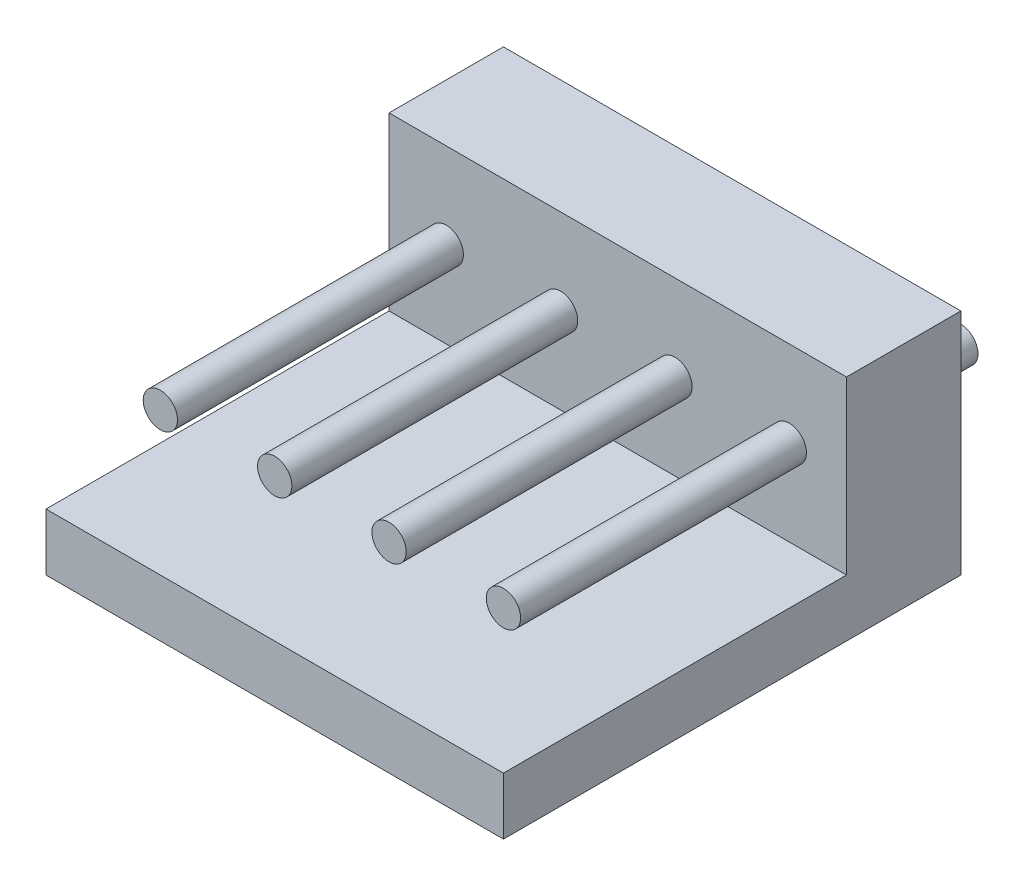
ISO-10303-21;
HEADER;
FILE_DESCRIPTION(('STEP AP214'),'2;1');
FILE_NAME('part.step','',(''),(''),'','','');
FILE_SCHEMA(('AUTOMOTIVE_DESIGN { 1 0 10303 214 1 1 1 1 }'));
ENDSEC;
DATA;
#1=APPLICATION_CONTEXT('core data for automotive mechanical design processes');
#2=APPLICATION_PROTOCOL_DEFINITION('international standard','automotive_design',2000,#1);
#3=PRODUCT_CONTEXT('',#1,'mechanical');
#4=PRODUCT('Part','Part','',(#3));
#5=PRODUCT_RELATED_PRODUCT_CATEGORY('part','',(#4));
#6=PRODUCT_DEFINITION_FORMATION('','',#4);
#7=PRODUCT_DEFINITION_CONTEXT('part definition',#1,'design');
#8=PRODUCT_DEFINITION('design','',#6,#7);
#9=PRODUCT_DEFINITION_SHAPE('','',#8);
#10=(LENGTH_UNIT() NAMED_UNIT(*) SI_UNIT(.MILLI.,.METRE.));
#11=(NAMED_UNIT(*) PLANE_ANGLE_UNIT() SI_UNIT($,.RADIAN.));
#12=(NAMED_UNIT(*) SI_UNIT($,.STERADIAN.) SOLID_ANGLE_UNIT());
#13=UNCERTAINTY_MEASURE_WITH_UNIT(LENGTH_MEASURE(1.E-05),#10,'distance_accuracy_value','');
#14=(GEOMETRIC_REPRESENTATION_CONTEXT(3) GLOBAL_UNCERTAINTY_ASSIGNED_CONTEXT((#13)) GLOBAL_UNIT_ASSIGNED_CONTEXT((#10,
#11,#12)) REPRESENTATION_CONTEXT('',''));
#15=CARTESIAN_POINT('',(0.,0.,0.));
#16=DIRECTION('',(0.,0.,1.));
#17=DIRECTION('',(1.,0.,0.));
#18=AXIS2_PLACEMENT_3D('',#15,#16,#17);
#19=CARTESIAN_POINT('',(0.,10.,5.));
#20=DIRECTION('',(0.,0.,-1.));
#21=DIRECTION('',(-1.,0.,0.));
#22=AXIS2_PLACEMENT_3D('',#19,#20,#21);
#23=PLANE('',#22);
#24=CARTESIAN_POINT('',(17.5,6.25,5.));
#25=DIRECTION('',(0.,0.,-1.));
#26=DIRECTION('',(-1.,0.,0.));
#27=AXIS2_PLACEMENT_3D('',#24,#25,#26);
#28=CIRCLE('',#27,0.750000000000002);
#29=CARTESIAN_POINT('',(16.75,6.25,5.));
#30=VERTEX_POINT('',#29);
#31=EDGE_CURVE('E38',#30,#30,#28,.F.);
#32=ORIENTED_EDGE('',*,*,#31,.F.);
#33=EDGE_LOOP('',(#32));
#34=FACE_BOUND('',#33,.T.);
#35=CARTESIAN_POINT('',(12.5,6.25,5.));
#36=DIRECTION('',(0.,0.,-1.));
#37=DIRECTION('',(-1.,0.,0.));
#38=AXIS2_PLACEMENT_3D('',#35,#36,#37);
#39=CIRCLE('',#38,0.75);
#40=CARTESIAN_POINT('',(11.75,6.25,5.));
#41=VERTEX_POINT('',#40);
#42=EDGE_CURVE('E146',#41,#41,#39,.F.);
#43=ORIENTED_EDGE('',*,*,#42,.F.);
#44=EDGE_LOOP('',(#43));
#45=FACE_BOUND('',#44,.T.);
#46=DIRECTION('',(-1.,0.,0.));
#47=VECTOR('',#46,1.);
#48=CARTESIAN_POINT('',(0.,2.5,5.));
#49=LINE('',#48,#47);
#50=CARTESIAN_POINT('',(20.,2.5,5.));
#51=VERTEX_POINT('',#50);
#52=CARTESIAN_POINT('',(0.,2.5,5.));
#53=VERTEX_POINT('',#52);
#54=EDGE_CURVE('E46',#51,#53,#49,.T.);
#55=ORIENTED_EDGE('',*,*,#54,.F.);
#56=DIRECTION('',(0.,1.,0.));
#57=VECTOR('',#56,1.);
#58=CARTESIAN_POINT('',(20.,0.,5.));
#59=LINE('',#58,#57);
#60=CARTESIAN_POINT('',(20.,10.,5.));
#61=VERTEX_POINT('',#60);
#62=EDGE_CURVE('E86',#51,#61,#59,.T.);
#63=ORIENTED_EDGE('',*,*,#62,.T.);
#64=DIRECTION('',(-1.,0.,0.));
#65=VECTOR('',#64,1.);
#66=CARTESIAN_POINT('',(0.,10.,5.));
#67=LINE('',#66,#65);
#68=CARTESIAN_POINT('',(0.,10.,5.));
#69=VERTEX_POINT('',#68);
#70=EDGE_CURVE('E51',#61,#69,#67,.T.);
#71=ORIENTED_EDGE('',*,*,#70,.T.);
#72=DIRECTION('',(0.,-1.,0.));
#73=VECTOR('',#72,1.);
#74=CARTESIAN_POINT('',(0.,0.,5.));
#75=LINE('',#74,#73);
#76=EDGE_CURVE('E81',#69,#53,#75,.T.);
#77=ORIENTED_EDGE('',*,*,#76,.T.);
#78=EDGE_LOOP('',(#55,#63,#71,#77));
#79=FACE_BOUND('',#78,.T.);
#80=CARTESIAN_POINT('',(7.5,6.25,5.));
#81=DIRECTION('',(0.,0.,-1.));
#82=DIRECTION('',(-1.,0.,0.));
#83=AXIS2_PLACEMENT_3D('',#80,#81,#82);
#84=CIRCLE('',#83,0.75);
#85=CARTESIAN_POINT('',(6.75,6.25,5.));
#86=VERTEX_POINT('',#85);
#87=EDGE_CURVE('E140',#86,#86,#84,.F.);
#88=ORIENTED_EDGE('',*,*,#87,.F.);
#89=EDGE_LOOP('',(#88));
#90=FACE_BOUND('',#89,.T.);
#91=CARTESIAN_POINT('',(2.5,6.25,5.));
#92=DIRECTION('',(0.,0.,-1.));
#93=DIRECTION('',(-1.,0.,0.));
#94=AXIS2_PLACEMENT_3D('',#91,#92,#93);
#95=CIRCLE('',#94,0.750000000000001);
#96=CARTESIAN_POINT('',(1.75,6.25,5.));
#97=VERTEX_POINT('',#96);
#98=EDGE_CURVE('E11',#97,#97,#95,.F.);
#99=ORIENTED_EDGE('',*,*,#98,.F.);
#100=EDGE_LOOP('',(#99));
#101=FACE_BOUND('',#100,.T.);
#102=ADVANCED_FACE('F29',(#34,#45,#79,#90,#101),#23,.F.);
#103=CARTESIAN_POINT('',(0.,10.,0.));
#104=DIRECTION('',(0.,0.,-1.));
#105=DIRECTION('',(-1.,0.,0.));
#106=AXIS2_PLACEMENT_3D('',#103,#104,#105);
#107=PLANE('',#106);
#108=CARTESIAN_POINT('',(17.5,6.25,0.));
#109=DIRECTION('',(0.,0.,-1.));
#110=DIRECTION('',(-1.,0.,0.));
#111=AXIS2_PLACEMENT_3D('',#108,#109,#110);
#112=CIRCLE('',#111,0.750000000000002);
#113=CARTESIAN_POINT('',(16.75,6.25,0.));
#114=VERTEX_POINT('',#113);
#115=EDGE_CURVE('E123',#114,#114,#112,.F.);
#116=ORIENTED_EDGE('',*,*,#115,.T.);
#117=EDGE_LOOP('',(#116));
#118=FACE_BOUND('',#117,.T.);
#119=CARTESIAN_POINT('',(12.5,6.25,0.));
#120=DIRECTION('',(0.,0.,-1.));
#121=DIRECTION('',(-1.,0.,0.));
#122=AXIS2_PLACEMENT_3D('',#119,#120,#121);
#123=CIRCLE('',#122,0.75);
#124=CARTESIAN_POINT('',(11.75,6.25,0.));
#125=VERTEX_POINT('',#124);
#126=EDGE_CURVE('E99',#125,#125,#123,.F.);
#127=ORIENTED_EDGE('',*,*,#126,.T.);
#128=EDGE_LOOP('',(#127));
#129=FACE_BOUND('',#128,.T.);
#130=DIRECTION('',(0.,-1.,0.));
#131=VECTOR('',#130,1.);
#132=CARTESIAN_POINT('',(0.,0.,0.));
#133=LINE('',#132,#131);
#134=CARTESIAN_POINT('',(0.,10.,0.));
#135=VERTEX_POINT('',#134);
#136=CARTESIAN_POINT('',(0.,0.,0.));
#137=VERTEX_POINT('',#136);
#138=EDGE_CURVE('E105',#135,#137,#133,.T.);
#139=ORIENTED_EDGE('',*,*,#138,.F.);
#140=DIRECTION('',(-1.,0.,0.));
#141=VECTOR('',#140,1.);
#142=CARTESIAN_POINT('',(0.,10.,0.));
#143=LINE('',#142,#141);
#144=CARTESIAN_POINT('',(20.,10.,0.));
#145=VERTEX_POINT('',#144);
#146=EDGE_CURVE('E87',#145,#135,#143,.T.);
#147=ORIENTED_EDGE('',*,*,#146,.F.);
#148=DIRECTION('',(0.,1.,0.));
#149=VECTOR('',#148,1.);
#150=CARTESIAN_POINT('',(20.,0.,0.));
#151=LINE('',#150,#149);
#152=CARTESIAN_POINT('',(20.,0.,0.));
#153=VERTEX_POINT('',#152);
#154=EDGE_CURVE('E163',#153,#145,#151,.T.);
#155=ORIENTED_EDGE('',*,*,#154,.F.);
#156=DIRECTION('',(1.,0.,0.));
#157=VECTOR('',#156,1.);
#158=CARTESIAN_POINT('',(0.,0.,0.));
#159=LINE('',#158,#157);
#160=EDGE_CURVE('E161',#137,#153,#159,.T.);
#161=ORIENTED_EDGE('',*,*,#160,.F.);
#162=EDGE_LOOP('',(#139,#147,#155,#161));
#163=FACE_BOUND('',#162,.T.);
#164=CARTESIAN_POINT('',(7.5,6.25,0.));
#165=DIRECTION('',(0.,0.,-1.));
#166=DIRECTION('',(-1.,0.,0.));
#167=AXIS2_PLACEMENT_3D('',#164,#165,#166);
#168=CIRCLE('',#167,0.75);
#169=CARTESIAN_POINT('',(6.75,6.25,0.));
#170=VERTEX_POINT('',#169);
#171=EDGE_CURVE('E119',#170,#170,#168,.F.);
#172=ORIENTED_EDGE('',*,*,#171,.T.);
#173=EDGE_LOOP('',(#172));
#174=FACE_BOUND('',#173,.T.);
#175=CARTESIAN_POINT('',(2.5,6.25,0.));
#176=DIRECTION('',(0.,0.,-1.));
#177=DIRECTION('',(-1.,0.,0.));
#178=AXIS2_PLACEMENT_3D('',#175,#176,#177);
#179=CIRCLE('',#178,0.750000000000001);
#180=CARTESIAN_POINT('',(1.75,6.25,0.));
#181=VERTEX_POINT('',#180);
#182=EDGE_CURVE('E33',#181,#181,#179,.F.);
#183=ORIENTED_EDGE('',*,*,#182,.T.);
#184=EDGE_LOOP('',(#183));
#185=FACE_BOUND('',#184,.T.);
#186=ADVANCED_FACE('F190',(#118,#129,#163,#174,#185),#107,.T.);
#187=CARTESIAN_POINT('',(0.,0.,5.));
#188=DIRECTION('',(1.,0.,0.));
#189=DIRECTION('',(0.,0.,-1.));
#190=AXIS2_PLACEMENT_3D('',#187,#188,#189);
#191=PLANE('',#190);
#192=ORIENTED_EDGE('',*,*,#138,.T.);
#193=DIRECTION('',(0.,0.,-1.));
#194=VECTOR('',#193,1.);
#195=CARTESIAN_POINT('',(0.,0.,5.));
#196=LINE('',#195,#194);
#197=CARTESIAN_POINT('',(0.,0.,20.));
#198=VERTEX_POINT('',#197);
#199=EDGE_CURVE('E152',#198,#137,#196,.T.);
#200=ORIENTED_EDGE('',*,*,#199,.F.);
#201=DIRECTION('',(0.,-1.,0.));
#202=VECTOR('',#201,1.);
#203=CARTESIAN_POINT('',(0.,0.,20.));
#204=LINE('',#203,#202);
#205=CARTESIAN_POINT('',(0.,2.5,20.));
#206=VERTEX_POINT('',#205);
#207=EDGE_CURVE('E98',#206,#198,#204,.T.);
#208=ORIENTED_EDGE('',*,*,#207,.F.);
#209=DIRECTION('',(0.,0.,-1.));
#210=VECTOR('',#209,1.);
#211=CARTESIAN_POINT('',(0.,2.5,20.));
#212=LINE('',#211,#210);
#213=EDGE_CURVE('E94',#206,#53,#212,.T.);
#214=ORIENTED_EDGE('',*,*,#213,.T.);
#215=ORIENTED_EDGE('',*,*,#76,.F.);
#216=DIRECTION('',(0.,0.,-1.));
#217=VECTOR('',#216,1.);
#218=CARTESIAN_POINT('',(0.,10.,5.));
#219=LINE('',#218,#217);
#220=EDGE_CURVE('E173',#69,#135,#219,.T.);
#221=ORIENTED_EDGE('',*,*,#220,.T.);
#222=EDGE_LOOP('',(#192,#200,#208,#214,#215,#221));
#223=FACE_BOUND('',#222,.T.);
#224=ADVANCED_FACE('F31',(#223),#191,.F.);
#225=CARTESIAN_POINT('',(0.,0.,5.));
#226=DIRECTION('',(0.,1.,0.));
#227=DIRECTION('',(0.,0.,1.));
#228=AXIS2_PLACEMENT_3D('',#225,#226,#227);
#229=PLANE('',#228);
#230=ORIENTED_EDGE('',*,*,#160,.T.);
#231=DIRECTION('',(0.,0.,-1.));
#232=VECTOR('',#231,1.);
#233=CARTESIAN_POINT('',(20.,0.,5.));
#234=LINE('',#233,#232);
#235=CARTESIAN_POINT('',(20.,0.,20.));
#236=VERTEX_POINT('',#235);
#237=EDGE_CURVE('E178',#236,#153,#234,.T.);
#238=ORIENTED_EDGE('',*,*,#237,.F.);
#239=DIRECTION('',(1.,0.,0.));
#240=VECTOR('',#239,1.);
#241=CARTESIAN_POINT('',(0.,0.,20.));
#242=LINE('',#241,#240);
#243=EDGE_CURVE('E156',#198,#236,#242,.T.);
#244=ORIENTED_EDGE('',*,*,#243,.F.);
#245=ORIENTED_EDGE('',*,*,#199,.T.);
#246=EDGE_LOOP('',(#230,#238,#244,#245));
#247=FACE_BOUND('',#246,.T.);
#248=ADVANCED_FACE('F186',(#247),#229,.F.);
#249=CARTESIAN_POINT('',(20.,0.,5.));
#250=DIRECTION('',(-1.,0.,0.));
#251=DIRECTION('',(0.,0.,1.));
#252=AXIS2_PLACEMENT_3D('',#249,#250,#251);
#253=PLANE('',#252);
#254=ORIENTED_EDGE('',*,*,#154,.T.);
#255=DIRECTION('',(0.,0.,-1.));
#256=VECTOR('',#255,1.);
#257=CARTESIAN_POINT('',(20.,10.,5.));
#258=LINE('',#257,#256);
#259=EDGE_CURVE('E174',#61,#145,#258,.T.);
#260=ORIENTED_EDGE('',*,*,#259,.F.);
#261=ORIENTED_EDGE('',*,*,#62,.F.);
#262=DIRECTION('',(0.,0.,-1.));
#263=VECTOR('',#262,1.);
#264=CARTESIAN_POINT('',(20.,2.5,20.));
#265=LINE('',#264,#263);
#266=CARTESIAN_POINT('',(20.,2.5,20.));
#267=VERTEX_POINT('',#266);
#268=EDGE_CURVE('E97',#267,#51,#265,.T.);
#269=ORIENTED_EDGE('',*,*,#268,.F.);
#270=DIRECTION('',(0.,1.,0.));
#271=VECTOR('',#270,1.);
#272=CARTESIAN_POINT('',(20.,0.,20.));
#273=LINE('',#272,#271);
#274=EDGE_CURVE('E107',#236,#267,#273,.T.);
#275=ORIENTED_EDGE('',*,*,#274,.F.);
#276=ORIENTED_EDGE('',*,*,#237,.T.);
#277=EDGE_LOOP('',(#254,#260,#261,#269,#275,#276));
#278=FACE_BOUND('',#277,.T.);
#279=ADVANCED_FACE('F192',(#278),#253,.F.);
#280=CARTESIAN_POINT('',(0.,10.,5.));
#281=DIRECTION('',(0.,-1.,0.));
#282=DIRECTION('',(0.,0.,-1.));
#283=AXIS2_PLACEMENT_3D('',#280,#281,#282);
#284=PLANE('',#283);
#285=ORIENTED_EDGE('',*,*,#146,.T.);
#286=ORIENTED_EDGE('',*,*,#220,.F.);
#287=ORIENTED_EDGE('',*,*,#70,.F.);
#288=ORIENTED_EDGE('',*,*,#259,.T.);
#289=EDGE_LOOP('',(#285,#286,#287,#288));
#290=FACE_BOUND('',#289,.T.);
#291=ADVANCED_FACE('F194',(#290),#284,.F.);
#292=CARTESIAN_POINT('',(0.,2.5,20.));
#293=DIRECTION('',(0.,-1.,0.));
#294=DIRECTION('',(0.,0.,-1.));
#295=AXIS2_PLACEMENT_3D('',#292,#293,#294);
#296=PLANE('',#295);
#297=ORIENTED_EDGE('',*,*,#54,.T.);
#298=ORIENTED_EDGE('',*,*,#213,.F.);
#299=DIRECTION('',(-1.,0.,0.));
#300=VECTOR('',#299,1.);
#301=CARTESIAN_POINT('',(0.,2.5,20.));
#302=LINE('',#301,#300);
#303=EDGE_CURVE('E103',#267,#206,#302,.T.);
#304=ORIENTED_EDGE('',*,*,#303,.F.);
#305=ORIENTED_EDGE('',*,*,#268,.T.);
#306=EDGE_LOOP('',(#297,#298,#304,#305));
#307=FACE_BOUND('',#306,.T.);
#308=ADVANCED_FACE('F92',(#307),#296,.F.);
#309=CARTESIAN_POINT('',(0.,2.5,20.));
#310=DIRECTION('',(0.,0.,-1.));
#311=DIRECTION('',(-1.,0.,0.));
#312=AXIS2_PLACEMENT_3D('',#309,#310,#311);
#313=PLANE('',#312);
#314=ORIENTED_EDGE('',*,*,#207,.T.);
#315=ORIENTED_EDGE('',*,*,#243,.T.);
#316=ORIENTED_EDGE('',*,*,#274,.T.);
#317=ORIENTED_EDGE('',*,*,#303,.T.);
#318=EDGE_LOOP('',(#314,#315,#316,#317));
#319=FACE_BOUND('',#318,.T.);
#320=ADVANCED_FACE('F201',(#319),#313,.F.);
#321=CARTESIAN_POINT('',(12.5,6.25,-2.5));
#322=DIRECTION('',(0.,0.,1.));
#323=DIRECTION('',(1.,0.,0.));
#324=AXIS2_PLACEMENT_3D('',#321,#322,#323);
#325=PLANE('',#324);
#326=CARTESIAN_POINT('',(12.5,6.25,-2.5));
#327=DIRECTION('',(0.,0.,1.));
#328=DIRECTION('',(1.,0.,0.));
#329=AXIS2_PLACEMENT_3D('',#326,#327,#328);
#330=CIRCLE('',#329,0.75);
#331=CARTESIAN_POINT('',(13.25,6.25,-2.5));
#332=VERTEX_POINT('',#331);
#333=EDGE_CURVE('E121',#332,#332,#330,.T.);
#334=ORIENTED_EDGE('',*,*,#333,.F.);
#335=EDGE_LOOP('',(#334));
#336=FACE_BOUND('',#335,.T.);
#337=ADVANCED_FACE('F216',(#336),#325,.F.);
#338=CARTESIAN_POINT('',(12.5,6.25,17.5));
#339=DIRECTION('',(0.,0.,-1.));
#340=DIRECTION('',(-1.,0.,0.));
#341=AXIS2_PLACEMENT_3D('',#338,#339,#340);
#342=CYLINDRICAL_SURFACE('',#341,0.75);
#343=ORIENTED_EDGE('',*,*,#126,.F.);
#344=EDGE_LOOP('',(#343));
#345=FACE_BOUND('',#344,.T.);
#346=ORIENTED_EDGE('',*,*,#333,.T.);
#347=EDGE_LOOP('',(#346));
#348=FACE_BOUND('',#347,.T.);
#349=ADVANCED_FACE('F218',(#345,#348),#342,.T.);
#350=CARTESIAN_POINT('',(12.5,6.25,17.5));
#351=DIRECTION('',(0.,0.,1.));
#352=DIRECTION('',(1.,0.,0.));
#353=AXIS2_PLACEMENT_3D('',#350,#351,#352);
#354=CIRCLE('',#353,0.75);
#355=CARTESIAN_POINT('',(13.25,6.25,17.5));
#356=VERTEX_POINT('',#355);
#357=EDGE_CURVE('E118',#356,#356,#354,.T.);
#358=ORIENTED_EDGE('',*,*,#357,.F.);
#359=EDGE_LOOP('',(#358));
#360=FACE_BOUND('',#359,.T.);
#361=ORIENTED_EDGE('',*,*,#42,.T.);
#362=EDGE_LOOP('',(#361));
#363=FACE_BOUND('',#362,.T.);
#364=ADVANCED_FACE('F221',(#360,#363),#342,.T.);
#365=CARTESIAN_POINT('',(12.5,6.25,17.5));
#366=DIRECTION('',(0.,0.,1.));
#367=DIRECTION('',(1.,0.,0.));
#368=AXIS2_PLACEMENT_3D('',#365,#366,#367);
#369=PLANE('',#368);
#370=ORIENTED_EDGE('',*,*,#357,.T.);
#371=EDGE_LOOP('',(#370));
#372=FACE_BOUND('',#371,.T.);
#373=ADVANCED_FACE('F223',(#372),#369,.T.);
#374=CARTESIAN_POINT('',(7.5,6.25,-2.5));
#375=DIRECTION('',(0.,0.,1.));
#376=DIRECTION('',(1.,0.,0.));
#377=AXIS2_PLACEMENT_3D('',#374,#375,#376);
#378=PLANE('',#377);
#379=CARTESIAN_POINT('',(7.5,6.25,-2.5));
#380=DIRECTION('',(0.,0.,1.));
#381=DIRECTION('',(1.,0.,0.));
#382=AXIS2_PLACEMENT_3D('',#379,#380,#381);
#383=CIRCLE('',#382,0.75);
#384=CARTESIAN_POINT('',(8.25,6.25,-2.5));
#385=VERTEX_POINT('',#384);
#386=EDGE_CURVE('E125',#385,#385,#383,.T.);
#387=ORIENTED_EDGE('',*,*,#386,.F.);
#388=EDGE_LOOP('',(#387));
#389=FACE_BOUND('',#388,.T.);
#390=ADVANCED_FACE('F226',(#389),#378,.F.);
#391=CARTESIAN_POINT('',(7.5,6.25,17.5));
#392=DIRECTION('',(0.,0.,-1.));
#393=DIRECTION('',(-1.,0.,0.));
#394=AXIS2_PLACEMENT_3D('',#391,#392,#393);
#395=CYLINDRICAL_SURFACE('',#394,0.75);
#396=ORIENTED_EDGE('',*,*,#171,.F.);
#397=EDGE_LOOP('',(#396));
#398=FACE_BOUND('',#397,.T.);
#399=ORIENTED_EDGE('',*,*,#386,.T.);
#400=EDGE_LOOP('',(#399));
#401=FACE_BOUND('',#400,.T.);
#402=ADVANCED_FACE('F231',(#398,#401),#395,.T.);
#403=CARTESIAN_POINT('',(7.5,6.25,17.5));
#404=DIRECTION('',(0.,0.,1.));
#405=DIRECTION('',(1.,0.,0.));
#406=AXIS2_PLACEMENT_3D('',#403,#404,#405);
#407=CIRCLE('',#406,0.75);
#408=CARTESIAN_POINT('',(8.25,6.25,17.5));
#409=VERTEX_POINT('',#408);
#410=EDGE_CURVE('E122',#409,#409,#407,.T.);
#411=ORIENTED_EDGE('',*,*,#410,.F.);
#412=EDGE_LOOP('',(#411));
#413=FACE_BOUND('',#412,.T.);
#414=ORIENTED_EDGE('',*,*,#87,.T.);
#415=EDGE_LOOP('',(#414));
#416=FACE_BOUND('',#415,.T.);
#417=ADVANCED_FACE('F234',(#413,#416),#395,.T.);
#418=CARTESIAN_POINT('',(7.5,6.25,17.5));
#419=DIRECTION('',(0.,0.,1.));
#420=DIRECTION('',(1.,0.,0.));
#421=AXIS2_PLACEMENT_3D('',#418,#419,#420);
#422=PLANE('',#421);
#423=ORIENTED_EDGE('',*,*,#410,.T.);
#424=EDGE_LOOP('',(#423));
#425=FACE_BOUND('',#424,.T.);
#426=ADVANCED_FACE('F236',(#425),#422,.T.);
#427=CARTESIAN_POINT('',(17.5,6.25,-2.5));
#428=DIRECTION('',(0.,0.,1.));
#429=DIRECTION('',(1.,0.,0.));
#430=AXIS2_PLACEMENT_3D('',#427,#428,#429);
#431=PLANE('',#430);
#432=CARTESIAN_POINT('',(17.5,6.25,-2.5));
#433=DIRECTION('',(0.,0.,1.));
#434=DIRECTION('',(1.,0.,0.));
#435=AXIS2_PLACEMENT_3D('',#432,#433,#434);
#436=CIRCLE('',#435,0.750000000000002);
#437=CARTESIAN_POINT('',(18.25,6.25,-2.5));
#438=VERTEX_POINT('',#437);
#439=EDGE_CURVE('E132',#438,#438,#436,.T.);
#440=ORIENTED_EDGE('',*,*,#439,.F.);
#441=EDGE_LOOP('',(#440));
#442=FACE_BOUND('',#441,.T.);
#443=ADVANCED_FACE('F239',(#442),#431,.F.);
#444=CARTESIAN_POINT('',(17.5,6.25,17.5));
#445=DIRECTION('',(0.,0.,-1.));
#446=DIRECTION('',(-1.,0.,0.));
#447=AXIS2_PLACEMENT_3D('',#444,#445,#446);
#448=CYLINDRICAL_SURFACE('',#447,0.750000000000002);
#449=ORIENTED_EDGE('',*,*,#115,.F.);
#450=EDGE_LOOP('',(#449));
#451=FACE_BOUND('',#450,.T.);
#452=ORIENTED_EDGE('',*,*,#439,.T.);
#453=EDGE_LOOP('',(#452));
#454=FACE_BOUND('',#453,.T.);
#455=ADVANCED_FACE('F244',(#451,#454),#448,.T.);
#456=CARTESIAN_POINT('',(17.5,6.25,17.5));
#457=DIRECTION('',(0.,0.,1.));
#458=DIRECTION('',(1.,0.,0.));
#459=AXIS2_PLACEMENT_3D('',#456,#457,#458);
#460=CIRCLE('',#459,0.750000000000002);
#461=CARTESIAN_POINT('',(18.25,6.25,17.5));
#462=VERTEX_POINT('',#461);
#463=EDGE_CURVE('E126',#462,#462,#460,.T.);
#464=ORIENTED_EDGE('',*,*,#463,.F.);
#465=EDGE_LOOP('',(#464));
#466=FACE_BOUND('',#465,.T.);
#467=ORIENTED_EDGE('',*,*,#31,.T.);
#468=EDGE_LOOP('',(#467));
#469=FACE_BOUND('',#468,.T.);
#470=ADVANCED_FACE('F247',(#466,#469),#448,.T.);
#471=CARTESIAN_POINT('',(17.5,6.25,17.5));
#472=DIRECTION('',(0.,0.,1.));
#473=DIRECTION('',(1.,0.,0.));
#474=AXIS2_PLACEMENT_3D('',#471,#472,#473);
#475=PLANE('',#474);
#476=ORIENTED_EDGE('',*,*,#463,.T.);
#477=EDGE_LOOP('',(#476));
#478=FACE_BOUND('',#477,.T.);
#479=ADVANCED_FACE('F249',(#478),#475,.T.);
#480=CARTESIAN_POINT('',(2.5,6.25,-2.5));
#481=DIRECTION('',(0.,0.,1.));
#482=DIRECTION('',(1.,0.,0.));
#483=AXIS2_PLACEMENT_3D('',#480,#481,#482);
#484=PLANE('',#483);
#485=CARTESIAN_POINT('',(2.5,6.25,-2.5));
#486=DIRECTION('',(0.,0.,1.));
#487=DIRECTION('',(1.,0.,0.));
#488=AXIS2_PLACEMENT_3D('',#485,#486,#487);
#489=CIRCLE('',#488,0.750000000000001);
#490=CARTESIAN_POINT('',(3.25,6.25,-2.5));
#491=VERTEX_POINT('',#490);
#492=EDGE_CURVE('E271',#491,#491,#489,.T.);
#493=ORIENTED_EDGE('',*,*,#492,.F.);
#494=EDGE_LOOP('',(#493));
#495=FACE_BOUND('',#494,.T.);
#496=ADVANCED_FACE('F252',(#495),#484,.F.);
#497=CARTESIAN_POINT('',(2.5,6.25,17.5));
#498=DIRECTION('',(0.,0.,-1.));
#499=DIRECTION('',(-1.,0.,0.));
#500=AXIS2_PLACEMENT_3D('',#497,#498,#499);
#501=CYLINDRICAL_SURFACE('',#500,0.750000000000001);
#502=ORIENTED_EDGE('',*,*,#182,.F.);
#503=EDGE_LOOP('',(#502));
#504=FACE_BOUND('',#503,.T.);
#505=ORIENTED_EDGE('',*,*,#492,.T.);
#506=EDGE_LOOP('',(#505));
#507=FACE_BOUND('',#506,.T.);
#508=ADVANCED_FACE('F256',(#504,#507),#501,.T.);
#509=CARTESIAN_POINT('',(2.5,6.25,17.5));
#510=DIRECTION('',(0.,0.,1.));
#511=DIRECTION('',(1.,0.,0.));
#512=AXIS2_PLACEMENT_3D('',#509,#510,#511);
#513=CIRCLE('',#512,0.750000000000001);
#514=CARTESIAN_POINT('',(3.25,6.25,17.5));
#515=VERTEX_POINT('',#514);
#516=EDGE_CURVE('E273',#515,#515,#513,.T.);
#517=ORIENTED_EDGE('',*,*,#516,.F.);
#518=EDGE_LOOP('',(#517));
#519=FACE_BOUND('',#518,.T.);
#520=ORIENTED_EDGE('',*,*,#98,.T.);
#521=EDGE_LOOP('',(#520));
#522=FACE_BOUND('',#521,.T.);
#523=ADVANCED_FACE('F259',(#519,#522),#501,.T.);
#524=CARTESIAN_POINT('',(2.5,6.25,17.5));
#525=DIRECTION('',(0.,0.,1.));
#526=DIRECTION('',(1.,0.,0.));
#527=AXIS2_PLACEMENT_3D('',#524,#525,#526);
#528=PLANE('',#527);
#529=ORIENTED_EDGE('',*,*,#516,.T.);
#530=EDGE_LOOP('',(#529));
#531=FACE_BOUND('',#530,.T.);
#532=ADVANCED_FACE('F261',(#531),#528,.T.);
#533=CLOSED_SHELL('',(#102,#186,#224,#248,#279,#291,#308,#320,#337,#349,#364,#373,#390,#402,
#417,#426,#443,#455,#470,#479,#496,#508,#523,#532));
#534=MANIFOLD_SOLID_BREP('B2',#533);
#535=ADVANCED_BREP_SHAPE_REPRESENTATION('',(#18,#534),#14);
#536=SHAPE_DEFINITION_REPRESENTATION(#9,#535);
ENDSEC;
END-ISO-10303-21;
